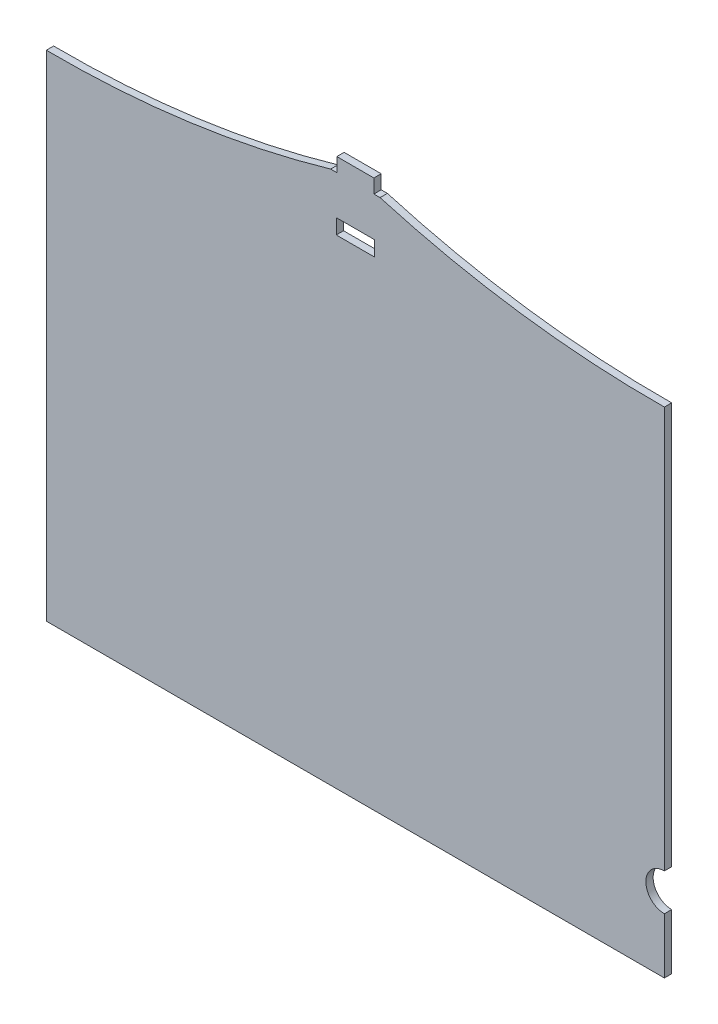
ISO-10303-21;
HEADER;
FILE_DESCRIPTION(('STEP AP214'),'2;1');
FILE_NAME('part.step','',(''),(''),'','','');
FILE_SCHEMA(('AUTOMOTIVE_DESIGN { 1 0 10303 214 1 1 1 1 }'));
ENDSEC;
DATA;
#1=APPLICATION_CONTEXT('core data for automotive mechanical design processes');
#2=APPLICATION_PROTOCOL_DEFINITION('international standard','automotive_design',2000,#1);
#3=PRODUCT_CONTEXT('',#1,'mechanical');
#4=PRODUCT('Part','Part','',(#3));
#5=PRODUCT_RELATED_PRODUCT_CATEGORY('part','',(#4));
#6=PRODUCT_DEFINITION_FORMATION('','',#4);
#7=PRODUCT_DEFINITION_CONTEXT('part definition',#1,'design');
#8=PRODUCT_DEFINITION('design','',#6,#7);
#9=PRODUCT_DEFINITION_SHAPE('','',#8);
#10=(LENGTH_UNIT() NAMED_UNIT(*) SI_UNIT(.MILLI.,.METRE.));
#11=(NAMED_UNIT(*) PLANE_ANGLE_UNIT() SI_UNIT($,.RADIAN.));
#12=(NAMED_UNIT(*) SI_UNIT($,.STERADIAN.) SOLID_ANGLE_UNIT());
#13=UNCERTAINTY_MEASURE_WITH_UNIT(LENGTH_MEASURE(1.E-05),#10,'distance_accuracy_value','');
#14=(GEOMETRIC_REPRESENTATION_CONTEXT(3) GLOBAL_UNCERTAINTY_ASSIGNED_CONTEXT((#13)) GLOBAL_UNIT_ASSIGNED_CONTEXT((#10,
#11,#12)) REPRESENTATION_CONTEXT('',''));
#15=CARTESIAN_POINT('',(0.,0.,0.));
#16=DIRECTION('',(0.,0.,1.));
#17=DIRECTION('',(1.,0.,0.));
#18=AXIS2_PLACEMENT_3D('',#15,#16,#17);
#19=CARTESIAN_POINT('',(-111.431811733447,453.585246871246,2.95));
#20=DIRECTION('',(0.,0.,1.));
#21=DIRECTION('',(1.,0.,0.));
#22=AXIS2_PLACEMENT_3D('',#19,#20,#21);
#23=PLANE('',#22);
#24=CARTESIAN_POINT('',(-111.431811733447,453.585246871246,2.95));
#25=DIRECTION('',(0.,0.,-1.));
#26=DIRECTION('',(1.,0.,0.));
#27=AXIS2_PLACEMENT_3D('',#24,#25,#26);
#28=CIRCLE('',#27,400.);
#29=CARTESIAN_POINT('',(0.171167623914634,69.4696718179025,2.95));
#30=VERTEX_POINT('',#29);
#31=CARTESIAN_POINT('',(-114.828832376085,53.5996718179025,2.95));
#32=VERTEX_POINT('',#31);
#33=EDGE_CURVE('E182',#30,#32,#28,.T.);
#34=ORIENTED_EDGE('',*,*,#33,.T.);
#35=DIRECTION('',(0.,-1.,0.));
#36=VECTOR('',#35,1.);
#37=CARTESIAN_POINT('',(-114.828832376085,53.5996718179025,2.95));
#38=LINE('',#37,#36);
#39=CARTESIAN_POINT('',(-114.828832376085,-146.400328182097,2.95));
#40=VERTEX_POINT('',#39);
#41=EDGE_CURVE('E185',#32,#40,#38,.T.);
#42=ORIENTED_EDGE('',*,*,#41,.T.);
#43=DIRECTION('',(1.,0.,0.));
#44=VECTOR('',#43,1.);
#45=CARTESIAN_POINT('',(-114.828832376085,-146.400328182097,2.95));
#46=LINE('',#45,#44);
#47=CARTESIAN_POINT('',(135.171167623915,-146.400328182097,2.95));
#48=VERTEX_POINT('',#47);
#49=EDGE_CURVE('E188',#40,#48,#46,.T.);
#50=ORIENTED_EDGE('',*,*,#49,.T.);
#51=DIRECTION('',(0.,1.,0.));
#52=VECTOR('',#51,1.);
#53=CARTESIAN_POINT('',(135.171167623915,-123.900328182098,2.95));
#54=LINE('',#53,#52);
#55=CARTESIAN_POINT('',(135.171167623915,-123.900328182098,2.95));
#56=VERTEX_POINT('',#55);
#57=EDGE_CURVE('E190',#48,#56,#54,.T.);
#58=ORIENTED_EDGE('',*,*,#57,.T.);
#59=CARTESIAN_POINT('',(135.171167623915,-116.400328182097,2.95));
#60=DIRECTION('',(0.,0.,-1.));
#61=DIRECTION('',(1.,0.,0.));
#62=AXIS2_PLACEMENT_3D('',#59,#60,#61);
#63=CIRCLE('',#62,7.50000000000002);
#64=CARTESIAN_POINT('',(135.171167623915,-108.900328182097,2.95));
#65=VERTEX_POINT('',#64);
#66=EDGE_CURVE('E192',#56,#65,#63,.T.);
#67=ORIENTED_EDGE('',*,*,#66,.T.);
#68=DIRECTION('',(0.,1.,0.));
#69=VECTOR('',#68,1.);
#70=CARTESIAN_POINT('',(135.171167623915,53.5996718179025,2.95));
#71=LINE('',#70,#69);
#72=CARTESIAN_POINT('',(135.171167623915,53.5996718179025,2.95));
#73=VERTEX_POINT('',#72);
#74=EDGE_CURVE('E194',#65,#73,#71,.T.);
#75=ORIENTED_EDGE('',*,*,#74,.T.);
#76=CARTESIAN_POINT('',(131.774146981276,453.585246871246,2.95));
#77=DIRECTION('',(0.,0.,-1.));
#78=DIRECTION('',(1.,0.,0.));
#79=AXIS2_PLACEMENT_3D('',#76,#77,#78);
#80=CIRCLE('',#79,400.);
#81=CARTESIAN_POINT('',(20.1711676239147,69.4696718179025,2.95));
#82=VERTEX_POINT('',#81);
#83=EDGE_CURVE('E196',#73,#82,#80,.T.);
#84=ORIENTED_EDGE('',*,*,#83,.T.);
#85=DIRECTION('',(-1.,0.,0.));
#86=VECTOR('',#85,1.);
#87=CARTESIAN_POINT('',(17.6711676239146,69.4696718179025,2.95));
#88=LINE('',#87,#86);
#89=CARTESIAN_POINT('',(17.6711676239146,69.4696718179025,2.95));
#90=VERTEX_POINT('',#89);
#91=EDGE_CURVE('E198',#82,#90,#88,.T.);
#92=ORIENTED_EDGE('',*,*,#91,.T.);
#93=DIRECTION('',(0.,1.,0.));
#94=VECTOR('',#93,1.);
#95=CARTESIAN_POINT('',(17.6711676239146,69.4696718179025,2.95));
#96=LINE('',#95,#94);
#97=CARTESIAN_POINT('',(17.6711676239146,75.0996718179025,2.95));
#98=VERTEX_POINT('',#97);
#99=EDGE_CURVE('E200',#90,#98,#96,.T.);
#100=ORIENTED_EDGE('',*,*,#99,.T.);
#101=DIRECTION('',(-1.,0.,0.));
#102=VECTOR('',#101,1.);
#103=CARTESIAN_POINT('',(2.67116762391463,75.0996718179025,2.95));
#104=LINE('',#103,#102);
#105=CARTESIAN_POINT('',(2.67116762391463,75.0996718179025,2.95));
#106=VERTEX_POINT('',#105);
#107=EDGE_CURVE('E202',#98,#106,#104,.T.);
#108=ORIENTED_EDGE('',*,*,#107,.T.);
#109=DIRECTION('',(0.,-1.,0.));
#110=VECTOR('',#109,1.);
#111=CARTESIAN_POINT('',(2.67116762391463,69.4696718179025,2.95));
#112=LINE('',#111,#110);
#113=CARTESIAN_POINT('',(2.67116762391463,69.4696718179025,2.95));
#114=VERTEX_POINT('',#113);
#115=EDGE_CURVE('E204',#106,#114,#112,.T.);
#116=ORIENTED_EDGE('',*,*,#115,.T.);
#117=DIRECTION('',(-1.,0.,0.));
#118=VECTOR('',#117,1.);
#119=CARTESIAN_POINT('',(0.171167623914634,69.4696718179025,2.95));
#120=LINE('',#119,#118);
#121=EDGE_CURVE('E206',#114,#30,#120,.T.);
#122=ORIENTED_EDGE('',*,*,#121,.T.);
#123=EDGE_LOOP('',(#34,#42,#50,#58,#67,#75,#84,#92,#100,#108,#116,#122));
#124=FACE_BOUND('',#123,.T.);
#125=DIRECTION('',(1.,0.,0.));
#126=VECTOR('',#125,1.);
#127=CARTESIAN_POINT('',(2.44616762391457,47.5196718179025,2.95));
#128=LINE('',#127,#126);
#129=CARTESIAN_POINT('',(2.44616762391457,47.5196718179025,2.95));
#130=VERTEX_POINT('',#129);
#131=CARTESIAN_POINT('',(17.8961676239146,47.5196718179025,2.95));
#132=VERTEX_POINT('',#131);
#133=EDGE_CURVE('E154',#130,#132,#128,.T.);
#134=ORIENTED_EDGE('',*,*,#133,.F.);
#135=DIRECTION('',(0.,-1.,0.));
#136=VECTOR('',#135,1.);
#137=CARTESIAN_POINT('',(2.44616762391457,53.5996718179025,2.95));
#138=LINE('',#137,#136);
#139=CARTESIAN_POINT('',(2.44616762391457,53.5996718179025,2.95));
#140=VERTEX_POINT('',#139);
#141=EDGE_CURVE('E146',#140,#130,#138,.T.);
#142=ORIENTED_EDGE('',*,*,#141,.F.);
#143=DIRECTION('',(-1.,0.,0.));
#144=VECTOR('',#143,1.);
#145=CARTESIAN_POINT('',(2.44616762391457,53.5996718179025,2.95));
#146=LINE('',#145,#144);
#147=CARTESIAN_POINT('',(17.8961676239146,53.5996718179025,2.95));
#148=VERTEX_POINT('',#147);
#149=EDGE_CURVE('E168',#148,#140,#146,.T.);
#150=ORIENTED_EDGE('',*,*,#149,.F.);
#151=DIRECTION('',(0.,1.,0.));
#152=VECTOR('',#151,1.);
#153=CARTESIAN_POINT('',(17.8961676239146,53.5996718179025,2.95));
#154=LINE('',#153,#152);
#155=EDGE_CURVE('E166',#132,#148,#154,.T.);
#156=ORIENTED_EDGE('',*,*,#155,.F.);
#157=EDGE_LOOP('',(#134,#142,#150,#156));
#158=FACE_BOUND('',#157,.T.);
#159=ADVANCED_FACE('F33',(#124,#158),#23,.T.);
#160=CARTESIAN_POINT('',(-111.431811733447,453.585246871246,0.));
#161=DIRECTION('',(0.,0.,1.));
#162=DIRECTION('',(1.,0.,0.));
#163=AXIS2_PLACEMENT_3D('',#160,#161,#162);
#164=PLANE('',#163);
#165=CARTESIAN_POINT('',(-111.431811733447,453.585246871246,0.));
#166=DIRECTION('',(0.,0.,-1.));
#167=DIRECTION('',(1.,0.,0.));
#168=AXIS2_PLACEMENT_3D('',#165,#166,#167);
#169=CIRCLE('',#168,400.);
#170=CARTESIAN_POINT('',(0.171167623914634,69.4696718179025,0.));
#171=VERTEX_POINT('',#170);
#172=CARTESIAN_POINT('',(-114.828832376085,53.5996718179025,0.));
#173=VERTEX_POINT('',#172);
#174=EDGE_CURVE('E162',#171,#173,#169,.T.);
#175=ORIENTED_EDGE('',*,*,#174,.F.);
#176=DIRECTION('',(-1.,0.,0.));
#177=VECTOR('',#176,1.);
#178=CARTESIAN_POINT('',(0.171167623914634,69.4696718179025,0.));
#179=LINE('',#178,#177);
#180=CARTESIAN_POINT('',(2.67116762391463,69.4696718179025,0.));
#181=VERTEX_POINT('',#180);
#182=EDGE_CURVE('E186',#181,#171,#179,.T.);
#183=ORIENTED_EDGE('',*,*,#182,.F.);
#184=DIRECTION('',(0.,-1.,0.));
#185=VECTOR('',#184,1.);
#186=CARTESIAN_POINT('',(2.67116762391463,69.4696718179025,0.));
#187=LINE('',#186,#185);
#188=CARTESIAN_POINT('',(2.67116762391463,75.0996718179025,0.));
#189=VERTEX_POINT('',#188);
#190=EDGE_CURVE('E229',#189,#181,#187,.T.);
#191=ORIENTED_EDGE('',*,*,#190,.F.);
#192=DIRECTION('',(-1.,0.,0.));
#193=VECTOR('',#192,1.);
#194=CARTESIAN_POINT('',(2.67116762391463,75.0996718179025,0.));
#195=LINE('',#194,#193);
#196=CARTESIAN_POINT('',(17.6711676239146,75.0996718179025,0.));
#197=VERTEX_POINT('',#196);
#198=EDGE_CURVE('E227',#197,#189,#195,.T.);
#199=ORIENTED_EDGE('',*,*,#198,.F.);
#200=DIRECTION('',(0.,1.,0.));
#201=VECTOR('',#200,1.);
#202=CARTESIAN_POINT('',(17.6711676239146,69.4696718179025,0.));
#203=LINE('',#202,#201);
#204=CARTESIAN_POINT('',(17.6711676239146,69.4696718179025,0.));
#205=VERTEX_POINT('',#204);
#206=EDGE_CURVE('E225',#205,#197,#203,.T.);
#207=ORIENTED_EDGE('',*,*,#206,.F.);
#208=DIRECTION('',(-1.,0.,0.));
#209=VECTOR('',#208,1.);
#210=CARTESIAN_POINT('',(17.6711676239146,69.4696718179025,0.));
#211=LINE('',#210,#209);
#212=CARTESIAN_POINT('',(20.1711676239147,69.4696718179025,0.));
#213=VERTEX_POINT('',#212);
#214=EDGE_CURVE('E223',#213,#205,#211,.T.);
#215=ORIENTED_EDGE('',*,*,#214,.F.);
#216=CARTESIAN_POINT('',(131.774146981276,453.585246871246,0.));
#217=DIRECTION('',(0.,0.,-1.));
#218=DIRECTION('',(1.,0.,0.));
#219=AXIS2_PLACEMENT_3D('',#216,#217,#218);
#220=CIRCLE('',#219,400.);
#221=CARTESIAN_POINT('',(135.171167623915,53.5996718179025,0.));
#222=VERTEX_POINT('',#221);
#223=EDGE_CURVE('E221',#222,#213,#220,.T.);
#224=ORIENTED_EDGE('',*,*,#223,.F.);
#225=DIRECTION('',(0.,1.,0.));
#226=VECTOR('',#225,1.);
#227=CARTESIAN_POINT('',(135.171167623915,53.5996718179025,0.));
#228=LINE('',#227,#226);
#229=CARTESIAN_POINT('',(135.171167623915,-108.900328182097,0.));
#230=VERTEX_POINT('',#229);
#231=EDGE_CURVE('E219',#230,#222,#228,.T.);
#232=ORIENTED_EDGE('',*,*,#231,.F.);
#233=CARTESIAN_POINT('',(135.171167623915,-116.400328182097,0.));
#234=DIRECTION('',(0.,0.,-1.));
#235=DIRECTION('',(1.,0.,0.));
#236=AXIS2_PLACEMENT_3D('',#233,#234,#235);
#237=CIRCLE('',#236,7.50000000000002);
#238=CARTESIAN_POINT('',(135.171167623915,-123.900328182098,0.));
#239=VERTEX_POINT('',#238);
#240=EDGE_CURVE('E217',#239,#230,#237,.T.);
#241=ORIENTED_EDGE('',*,*,#240,.F.);
#242=DIRECTION('',(0.,1.,0.));
#243=VECTOR('',#242,1.);
#244=CARTESIAN_POINT('',(135.171167623915,-123.900328182098,0.));
#245=LINE('',#244,#243);
#246=CARTESIAN_POINT('',(135.171167623915,-146.400328182097,0.));
#247=VERTEX_POINT('',#246);
#248=EDGE_CURVE('E215',#247,#239,#245,.T.);
#249=ORIENTED_EDGE('',*,*,#248,.F.);
#250=DIRECTION('',(1.,0.,0.));
#251=VECTOR('',#250,1.);
#252=CARTESIAN_POINT('',(-114.828832376085,-146.400328182097,0.));
#253=LINE('',#252,#251);
#254=CARTESIAN_POINT('',(-114.828832376085,-146.400328182097,0.));
#255=VERTEX_POINT('',#254);
#256=EDGE_CURVE('E213',#255,#247,#253,.T.);
#257=ORIENTED_EDGE('',*,*,#256,.F.);
#258=DIRECTION('',(0.,-1.,0.));
#259=VECTOR('',#258,1.);
#260=CARTESIAN_POINT('',(-114.828832376085,53.5996718179025,0.));
#261=LINE('',#260,#259);
#262=EDGE_CURVE('E211',#173,#255,#261,.T.);
#263=ORIENTED_EDGE('',*,*,#262,.F.);
#264=EDGE_LOOP('',(#175,#183,#191,#199,#207,#215,#224,#232,#241,#249,#257,#263));
#265=FACE_BOUND('',#264,.T.);
#266=DIRECTION('',(0.,-1.,0.));
#267=VECTOR('',#266,1.);
#268=CARTESIAN_POINT('',(2.44616762391457,53.5996718179025,0.));
#269=LINE('',#268,#267);
#270=CARTESIAN_POINT('',(2.44616762391457,53.5996718179025,0.));
#271=VERTEX_POINT('',#270);
#272=CARTESIAN_POINT('',(2.44616762391457,47.5196718179025,0.));
#273=VERTEX_POINT('',#272);
#274=EDGE_CURVE('E56',#271,#273,#269,.T.);
#275=ORIENTED_EDGE('',*,*,#274,.T.);
#276=DIRECTION('',(1.,0.,0.));
#277=VECTOR('',#276,1.);
#278=CARTESIAN_POINT('',(2.44616762391457,47.5196718179025,0.));
#279=LINE('',#278,#277);
#280=CARTESIAN_POINT('',(17.8961676239146,47.5196718179025,0.));
#281=VERTEX_POINT('',#280);
#282=EDGE_CURVE('E161',#273,#281,#279,.T.);
#283=ORIENTED_EDGE('',*,*,#282,.T.);
#284=DIRECTION('',(0.,1.,0.));
#285=VECTOR('',#284,1.);
#286=CARTESIAN_POINT('',(17.8961676239146,53.5996718179025,0.));
#287=LINE('',#286,#285);
#288=CARTESIAN_POINT('',(17.8961676239146,53.5996718179025,0.));
#289=VERTEX_POINT('',#288);
#290=EDGE_CURVE('E174',#281,#289,#287,.T.);
#291=ORIENTED_EDGE('',*,*,#290,.T.);
#292=DIRECTION('',(-1.,0.,0.));
#293=VECTOR('',#292,1.);
#294=CARTESIAN_POINT('',(2.44616762391457,53.5996718179025,0.));
#295=LINE('',#294,#293);
#296=EDGE_CURVE('E155',#289,#271,#295,.T.);
#297=ORIENTED_EDGE('',*,*,#296,.T.);
#298=EDGE_LOOP('',(#275,#283,#291,#297));
#299=FACE_BOUND('',#298,.T.);
#300=ADVANCED_FACE('F271',(#265,#299),#164,.F.);
#301=CARTESIAN_POINT('',(-111.431811733447,453.585246871246,2.95));
#302=DIRECTION('',(0.,0.,-1.));
#303=DIRECTION('',(-1.,0.,0.));
#304=AXIS2_PLACEMENT_3D('',#301,#302,#303);
#305=CYLINDRICAL_SURFACE('',#304,400.);
#306=ORIENTED_EDGE('',*,*,#174,.T.);
#307=DIRECTION('',(0.,0.,-1.));
#308=VECTOR('',#307,1.);
#309=CARTESIAN_POINT('',(-114.828832376085,53.5996718179025,2.95));
#310=LINE('',#309,#308);
#311=EDGE_CURVE('E11',#32,#173,#310,.T.);
#312=ORIENTED_EDGE('',*,*,#311,.F.);
#313=ORIENTED_EDGE('',*,*,#33,.F.);
#314=DIRECTION('',(0.,0.,-1.));
#315=VECTOR('',#314,1.);
#316=CARTESIAN_POINT('',(0.171167623914634,69.4696718179025,2.95));
#317=LINE('',#316,#315);
#318=EDGE_CURVE('E208',#30,#171,#317,.T.);
#319=ORIENTED_EDGE('',*,*,#318,.T.);
#320=EDGE_LOOP('',(#306,#312,#313,#319));
#321=FACE_BOUND('',#320,.T.);
#322=ADVANCED_FACE('F35',(#321),#305,.F.);
#323=CARTESIAN_POINT('',(-114.828832376085,53.5996718179025,2.95));
#324=DIRECTION('',(1.,0.,0.));
#325=DIRECTION('',(0.,1.,0.));
#326=AXIS2_PLACEMENT_3D('',#323,#324,#325);
#327=PLANE('',#326);
#328=ORIENTED_EDGE('',*,*,#262,.T.);
#329=DIRECTION('',(0.,0.,-1.));
#330=VECTOR('',#329,1.);
#331=CARTESIAN_POINT('',(-114.828832376085,-146.400328182097,2.95));
#332=LINE('',#331,#330);
#333=EDGE_CURVE('E41',#40,#255,#332,.T.);
#334=ORIENTED_EDGE('',*,*,#333,.F.);
#335=ORIENTED_EDGE('',*,*,#41,.F.);
#336=ORIENTED_EDGE('',*,*,#311,.T.);
#337=EDGE_LOOP('',(#328,#334,#335,#336));
#338=FACE_BOUND('',#337,.T.);
#339=ADVANCED_FACE('F288',(#338),#327,.F.);
#340=CARTESIAN_POINT('',(-114.828832376085,-146.400328182097,2.95));
#341=DIRECTION('',(0.,1.,0.));
#342=DIRECTION('',(0.,0.,1.));
#343=AXIS2_PLACEMENT_3D('',#340,#341,#342);
#344=PLANE('',#343);
#345=ORIENTED_EDGE('',*,*,#256,.T.);
#346=DIRECTION('',(0.,0.,-1.));
#347=VECTOR('',#346,1.);
#348=CARTESIAN_POINT('',(135.171167623915,-146.400328182097,2.95));
#349=LINE('',#348,#347);
#350=EDGE_CURVE('E258',#48,#247,#349,.T.);
#351=ORIENTED_EDGE('',*,*,#350,.F.);
#352=ORIENTED_EDGE('',*,*,#49,.F.);
#353=ORIENTED_EDGE('',*,*,#333,.T.);
#354=EDGE_LOOP('',(#345,#351,#352,#353));
#355=FACE_BOUND('',#354,.T.);
#356=ADVANCED_FACE('F265',(#355),#344,.F.);
#357=CARTESIAN_POINT('',(135.171167623915,-123.900328182098,2.95));
#358=DIRECTION('',(-1.,0.,0.));
#359=DIRECTION('',(0.,0.,1.));
#360=AXIS2_PLACEMENT_3D('',#357,#358,#359);
#361=PLANE('',#360);
#362=ORIENTED_EDGE('',*,*,#248,.T.);
#363=DIRECTION('',(0.,0.,-1.));
#364=VECTOR('',#363,1.);
#365=CARTESIAN_POINT('',(135.171167623915,-123.900328182098,2.95));
#366=LINE('',#365,#364);
#367=EDGE_CURVE('E255',#56,#239,#366,.T.);
#368=ORIENTED_EDGE('',*,*,#367,.F.);
#369=ORIENTED_EDGE('',*,*,#57,.F.);
#370=ORIENTED_EDGE('',*,*,#350,.T.);
#371=EDGE_LOOP('',(#362,#368,#369,#370));
#372=FACE_BOUND('',#371,.T.);
#373=ADVANCED_FACE('F277',(#372),#361,.F.);
#374=CARTESIAN_POINT('',(135.171167623915,-116.400328182097,2.95));
#375=DIRECTION('',(0.,0.,-1.));
#376=DIRECTION('',(-1.,0.,0.));
#377=AXIS2_PLACEMENT_3D('',#374,#375,#376);
#378=CYLINDRICAL_SURFACE('',#377,7.50000000000002);
#379=ORIENTED_EDGE('',*,*,#240,.T.);
#380=DIRECTION('',(0.,0.,-1.));
#381=VECTOR('',#380,1.);
#382=CARTESIAN_POINT('',(135.171167623915,-108.900328182097,2.95));
#383=LINE('',#382,#381);
#384=EDGE_CURVE('E252',#65,#230,#383,.T.);
#385=ORIENTED_EDGE('',*,*,#384,.F.);
#386=ORIENTED_EDGE('',*,*,#66,.F.);
#387=ORIENTED_EDGE('',*,*,#367,.T.);
#388=EDGE_LOOP('',(#379,#385,#386,#387));
#389=FACE_BOUND('',#388,.T.);
#390=ADVANCED_FACE('F281',(#389),#378,.F.);
#391=CARTESIAN_POINT('',(135.171167623915,53.5996718179025,2.95));
#392=DIRECTION('',(-1.,0.,0.));
#393=DIRECTION('',(0.,-1.,0.));
#394=AXIS2_PLACEMENT_3D('',#391,#392,#393);
#395=PLANE('',#394);
#396=ORIENTED_EDGE('',*,*,#231,.T.);
#397=DIRECTION('',(0.,0.,-1.));
#398=VECTOR('',#397,1.);
#399=CARTESIAN_POINT('',(135.171167623915,53.5996718179025,2.95));
#400=LINE('',#399,#398);
#401=EDGE_CURVE('E249',#73,#222,#400,.T.);
#402=ORIENTED_EDGE('',*,*,#401,.F.);
#403=ORIENTED_EDGE('',*,*,#74,.F.);
#404=ORIENTED_EDGE('',*,*,#384,.T.);
#405=EDGE_LOOP('',(#396,#402,#403,#404));
#406=FACE_BOUND('',#405,.T.);
#407=ADVANCED_FACE('F321',(#406),#395,.F.);
#408=CARTESIAN_POINT('',(131.774146981276,453.585246871246,2.95));
#409=DIRECTION('',(0.,0.,-1.));
#410=DIRECTION('',(-1.,0.,0.));
#411=AXIS2_PLACEMENT_3D('',#408,#409,#410);
#412=CYLINDRICAL_SURFACE('',#411,400.);
#413=ORIENTED_EDGE('',*,*,#223,.T.);
#414=DIRECTION('',(0.,0.,-1.));
#415=VECTOR('',#414,1.);
#416=CARTESIAN_POINT('',(20.1711676239147,69.4696718179025,2.95));
#417=LINE('',#416,#415);
#418=EDGE_CURVE('E246',#82,#213,#417,.T.);
#419=ORIENTED_EDGE('',*,*,#418,.F.);
#420=ORIENTED_EDGE('',*,*,#83,.F.);
#421=ORIENTED_EDGE('',*,*,#401,.T.);
#422=EDGE_LOOP('',(#413,#419,#420,#421));
#423=FACE_BOUND('',#422,.T.);
#424=ADVANCED_FACE('F319',(#423),#412,.F.);
#425=CARTESIAN_POINT('',(17.6711676239146,69.4696718179025,2.95));
#426=DIRECTION('',(0.,-1.,0.));
#427=DIRECTION('',(0.,0.,-1.));
#428=AXIS2_PLACEMENT_3D('',#425,#426,#427);
#429=PLANE('',#428);
#430=ORIENTED_EDGE('',*,*,#214,.T.);
#431=DIRECTION('',(0.,0.,-1.));
#432=VECTOR('',#431,1.);
#433=CARTESIAN_POINT('',(17.6711676239146,69.4696718179025,2.95));
#434=LINE('',#433,#432);
#435=EDGE_CURVE('E243',#90,#205,#434,.T.);
#436=ORIENTED_EDGE('',*,*,#435,.F.);
#437=ORIENTED_EDGE('',*,*,#91,.F.);
#438=ORIENTED_EDGE('',*,*,#418,.T.);
#439=EDGE_LOOP('',(#430,#436,#437,#438));
#440=FACE_BOUND('',#439,.T.);
#441=ADVANCED_FACE('F315',(#440),#429,.F.);
#442=CARTESIAN_POINT('',(17.6711676239146,69.4696718179025,2.95));
#443=DIRECTION('',(-1.,0.,0.));
#444=DIRECTION('',(0.,0.,1.));
#445=AXIS2_PLACEMENT_3D('',#442,#443,#444);
#446=PLANE('',#445);
#447=ORIENTED_EDGE('',*,*,#206,.T.);
#448=DIRECTION('',(0.,0.,-1.));
#449=VECTOR('',#448,1.);
#450=CARTESIAN_POINT('',(17.6711676239146,75.0996718179025,2.95));
#451=LINE('',#450,#449);
#452=EDGE_CURVE('E240',#98,#197,#451,.T.);
#453=ORIENTED_EDGE('',*,*,#452,.F.);
#454=ORIENTED_EDGE('',*,*,#99,.F.);
#455=ORIENTED_EDGE('',*,*,#435,.T.);
#456=EDGE_LOOP('',(#447,#453,#454,#455));
#457=FACE_BOUND('',#456,.T.);
#458=ADVANCED_FACE('F310',(#457),#446,.F.);
#459=CARTESIAN_POINT('',(2.67116762391463,75.0996718179025,2.95));
#460=DIRECTION('',(0.,-1.,0.));
#461=DIRECTION('',(0.,0.,-1.));
#462=AXIS2_PLACEMENT_3D('',#459,#460,#461);
#463=PLANE('',#462);
#464=ORIENTED_EDGE('',*,*,#198,.T.);
#465=DIRECTION('',(0.,0.,-1.));
#466=VECTOR('',#465,1.);
#467=CARTESIAN_POINT('',(2.67116762391463,75.0996718179025,2.95));
#468=LINE('',#467,#466);
#469=EDGE_CURVE('E237',#106,#189,#468,.T.);
#470=ORIENTED_EDGE('',*,*,#469,.F.);
#471=ORIENTED_EDGE('',*,*,#107,.F.);
#472=ORIENTED_EDGE('',*,*,#452,.T.);
#473=EDGE_LOOP('',(#464,#470,#471,#472));
#474=FACE_BOUND('',#473,.T.);
#475=ADVANCED_FACE('F304',(#474),#463,.F.);
#476=CARTESIAN_POINT('',(2.67116762391463,69.4696718179025,2.95));
#477=DIRECTION('',(1.,0.,0.));
#478=DIRECTION('',(0.,0.,-1.));
#479=AXIS2_PLACEMENT_3D('',#476,#477,#478);
#480=PLANE('',#479);
#481=ORIENTED_EDGE('',*,*,#190,.T.);
#482=DIRECTION('',(0.,0.,-1.));
#483=VECTOR('',#482,1.);
#484=CARTESIAN_POINT('',(2.67116762391463,69.4696718179025,2.95));
#485=LINE('',#484,#483);
#486=EDGE_CURVE('E234',#114,#181,#485,.T.);
#487=ORIENTED_EDGE('',*,*,#486,.F.);
#488=ORIENTED_EDGE('',*,*,#115,.F.);
#489=ORIENTED_EDGE('',*,*,#469,.T.);
#490=EDGE_LOOP('',(#481,#487,#488,#489));
#491=FACE_BOUND('',#490,.T.);
#492=ADVANCED_FACE('F300',(#491),#480,.F.);
#493=CARTESIAN_POINT('',(0.171167623914634,69.4696718179025,2.95));
#494=DIRECTION('',(0.,-1.,0.));
#495=DIRECTION('',(0.,0.,-1.));
#496=AXIS2_PLACEMENT_3D('',#493,#494,#495);
#497=PLANE('',#496);
#498=ORIENTED_EDGE('',*,*,#182,.T.);
#499=ORIENTED_EDGE('',*,*,#318,.F.);
#500=ORIENTED_EDGE('',*,*,#121,.F.);
#501=ORIENTED_EDGE('',*,*,#486,.T.);
#502=EDGE_LOOP('',(#498,#499,#500,#501));
#503=FACE_BOUND('',#502,.T.);
#504=ADVANCED_FACE('F295',(#503),#497,.F.);
#505=CARTESIAN_POINT('',(2.44616762391457,53.5996718179025,2.95));
#506=DIRECTION('',(1.,0.,0.));
#507=DIRECTION('',(0.,0.,-1.));
#508=AXIS2_PLACEMENT_3D('',#505,#506,#507);
#509=PLANE('',#508);
#510=ORIENTED_EDGE('',*,*,#274,.F.);
#511=DIRECTION('',(0.,0.,-1.));
#512=VECTOR('',#511,1.);
#513=CARTESIAN_POINT('',(2.44616762391457,53.5996718179025,2.95));
#514=LINE('',#513,#512);
#515=EDGE_CURVE('E150',#140,#271,#514,.T.);
#516=ORIENTED_EDGE('',*,*,#515,.F.);
#517=ORIENTED_EDGE('',*,*,#141,.T.);
#518=DIRECTION('',(0.,0.,-1.));
#519=VECTOR('',#518,1.);
#520=CARTESIAN_POINT('',(2.44616762391457,47.5196718179025,2.95));
#521=LINE('',#520,#519);
#522=EDGE_CURVE('E149',#130,#273,#521,.T.);
#523=ORIENTED_EDGE('',*,*,#522,.T.);
#524=EDGE_LOOP('',(#510,#516,#517,#523));
#525=FACE_BOUND('',#524,.T.);
#526=ADVANCED_FACE('F148',(#525),#509,.T.);
#527=CARTESIAN_POINT('',(2.44616762391457,47.5196718179025,2.95));
#528=DIRECTION('',(0.,1.,0.));
#529=DIRECTION('',(0.,0.,1.));
#530=AXIS2_PLACEMENT_3D('',#527,#528,#529);
#531=PLANE('',#530);
#532=ORIENTED_EDGE('',*,*,#282,.F.);
#533=ORIENTED_EDGE('',*,*,#522,.F.);
#534=ORIENTED_EDGE('',*,*,#133,.T.);
#535=DIRECTION('',(0.,0.,-1.));
#536=VECTOR('',#535,1.);
#537=CARTESIAN_POINT('',(17.8961676239146,47.5196718179025,2.95));
#538=LINE('',#537,#536);
#539=EDGE_CURVE('E163',#132,#281,#538,.T.);
#540=ORIENTED_EDGE('',*,*,#539,.T.);
#541=EDGE_LOOP('',(#532,#533,#534,#540));
#542=FACE_BOUND('',#541,.T.);
#543=ADVANCED_FACE('F158',(#542),#531,.T.);
#544=CARTESIAN_POINT('',(17.8961676239146,53.5996718179025,2.95));
#545=DIRECTION('',(-1.,0.,0.));
#546=DIRECTION('',(0.,-1.,0.));
#547=AXIS2_PLACEMENT_3D('',#544,#545,#546);
#548=PLANE('',#547);
#549=ORIENTED_EDGE('',*,*,#290,.F.);
#550=ORIENTED_EDGE('',*,*,#539,.F.);
#551=ORIENTED_EDGE('',*,*,#155,.T.);
#552=DIRECTION('',(0.,0.,-1.));
#553=VECTOR('',#552,1.);
#554=CARTESIAN_POINT('',(17.8961676239146,53.5996718179025,2.95));
#555=LINE('',#554,#553);
#556=EDGE_CURVE('E48',#148,#289,#555,.T.);
#557=ORIENTED_EDGE('',*,*,#556,.T.);
#558=EDGE_LOOP('',(#549,#550,#551,#557));
#559=FACE_BOUND('',#558,.T.);
#560=ADVANCED_FACE('F379',(#559),#548,.T.);
#561=CARTESIAN_POINT('',(2.44616762391457,53.5996718179025,2.95));
#562=DIRECTION('',(0.,-1.,0.));
#563=DIRECTION('',(0.,0.,-1.));
#564=AXIS2_PLACEMENT_3D('',#561,#562,#563);
#565=PLANE('',#564);
#566=ORIENTED_EDGE('',*,*,#296,.F.);
#567=ORIENTED_EDGE('',*,*,#556,.F.);
#568=ORIENTED_EDGE('',*,*,#149,.T.);
#569=ORIENTED_EDGE('',*,*,#515,.T.);
#570=EDGE_LOOP('',(#566,#567,#568,#569));
#571=FACE_BOUND('',#570,.T.);
#572=ADVANCED_FACE('F385',(#571),#565,.T.);
#573=CLOSED_SHELL('',(#159,#300,#322,#339,#356,#373,#390,#407,#424,#441,#458,#475,#492,#504,
#526,#543,#560,#572));
#574=MANIFOLD_SOLID_BREP('B2',#573);
#575=ADVANCED_BREP_SHAPE_REPRESENTATION('',(#18,#574),#14);
#576=SHAPE_DEFINITION_REPRESENTATION(#9,#575);
ENDSEC;
END-ISO-10303-21;
